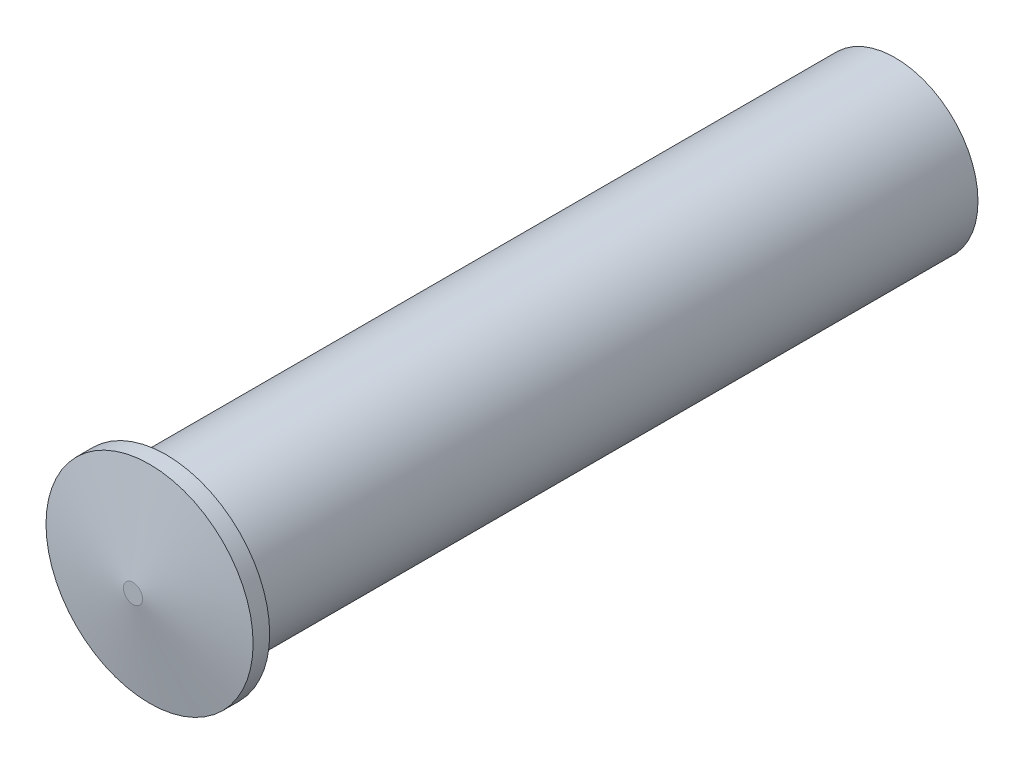
ISO-10303-21;
HEADER;
FILE_DESCRIPTION(('STEP AP214'),'2;1');
FILE_NAME('part.step','',(''),(''),'','','');
FILE_SCHEMA(('AUTOMOTIVE_DESIGN { 1 0 10303 214 1 1 1 1 }'));
ENDSEC;
DATA;
#1=APPLICATION_CONTEXT('core data for automotive mechanical design processes');
#2=APPLICATION_PROTOCOL_DEFINITION('international standard','automotive_design',2000,#1);
#3=PRODUCT_CONTEXT('',#1,'mechanical');
#4=PRODUCT('Part','Part','',(#3));
#5=PRODUCT_RELATED_PRODUCT_CATEGORY('part','',(#4));
#6=PRODUCT_DEFINITION_FORMATION('','',#4);
#7=PRODUCT_DEFINITION_CONTEXT('part definition',#1,'design');
#8=PRODUCT_DEFINITION('design','',#6,#7);
#9=PRODUCT_DEFINITION_SHAPE('','',#8);
#10=(LENGTH_UNIT() NAMED_UNIT(*) SI_UNIT(.MILLI.,.METRE.));
#11=(NAMED_UNIT(*) PLANE_ANGLE_UNIT() SI_UNIT($,.RADIAN.));
#12=(NAMED_UNIT(*) SI_UNIT($,.STERADIAN.) SOLID_ANGLE_UNIT());
#13=UNCERTAINTY_MEASURE_WITH_UNIT(LENGTH_MEASURE(1.E-05),#10,'distance_accuracy_value','');
#14=(GEOMETRIC_REPRESENTATION_CONTEXT(3) GLOBAL_UNCERTAINTY_ASSIGNED_CONTEXT((#13)) GLOBAL_UNIT_ASSIGNED_CONTEXT((#10,
#11,#12)) REPRESENTATION_CONTEXT('',''));
#15=CARTESIAN_POINT('',(0.,0.,0.));
#16=DIRECTION('',(0.,0.,1.));
#17=DIRECTION('',(1.,0.,0.));
#18=AXIS2_PLACEMENT_3D('',#15,#16,#17);
#19=CARTESIAN_POINT('',(0.,0.,-88.));
#20=DIRECTION('',(0.,0.,1.));
#21=DIRECTION('',(1.,0.,0.));
#22=AXIS2_PLACEMENT_3D('',#19,#20,#21);
#23=CYLINDRICAL_SURFACE('',#22,10.);
#24=CARTESIAN_POINT('',(0.,0.,-88.));
#25=DIRECTION('',(0.,0.,1.));
#26=DIRECTION('',(1.,0.,0.));
#27=AXIS2_PLACEMENT_3D('',#24,#25,#26);
#28=CIRCLE('',#27,10.);
#29=CARTESIAN_POINT('',(10.,0.,-88.));
#30=VERTEX_POINT('',#29);
#31=EDGE_CURVE('E10',#30,#30,#28,.T.);
#32=ORIENTED_EDGE('',*,*,#31,.T.);
#33=EDGE_LOOP('',(#32));
#34=FACE_BOUND('',#33,.T.);
#35=CARTESIAN_POINT('',(0.,0.,0.));
#36=DIRECTION('',(0.,0.,1.));
#37=DIRECTION('',(1.,0.,0.));
#38=AXIS2_PLACEMENT_3D('',#35,#36,#37);
#39=CIRCLE('',#38,10.);
#40=CARTESIAN_POINT('',(10.,0.,0.));
#41=VERTEX_POINT('',#40);
#42=EDGE_CURVE('E37',#41,#41,#39,.T.);
#43=ORIENTED_EDGE('',*,*,#42,.F.);
#44=EDGE_LOOP('',(#43));
#45=FACE_BOUND('',#44,.T.);
#46=ADVANCED_FACE('F34',(#34,#45),#23,.T.);
#47=CARTESIAN_POINT('',(0.,0.,-88.));
#48=DIRECTION('',(0.,0.,1.));
#49=DIRECTION('',(1.,0.,0.));
#50=AXIS2_PLACEMENT_3D('',#47,#48,#49);
#51=PLANE('',#50);
#52=CARTESIAN_POINT('',(0.,0.,-88.));
#53=DIRECTION('',(0.,0.,-1.));
#54=DIRECTION('',(-1.,0.,0.));
#55=AXIS2_PLACEMENT_3D('',#52,#53,#54);
#56=CIRCLE('',#55,8.);
#57=CARTESIAN_POINT('',(-8.,0.,-88.));
#58=VERTEX_POINT('',#57);
#59=EDGE_CURVE('E55',#58,#58,#56,.T.);
#60=ORIENTED_EDGE('',*,*,#59,.F.);
#61=EDGE_LOOP('',(#60));
#62=FACE_BOUND('',#61,.T.);
#63=ORIENTED_EDGE('',*,*,#31,.F.);
#64=EDGE_LOOP('',(#63));
#65=FACE_BOUND('',#64,.T.);
#66=ADVANCED_FACE('F70',(#62,#65),#51,.F.);
#67=CARTESIAN_POINT('',(0.,0.,2.));
#68=DIRECTION('',(0.,0.,-1.));
#69=DIRECTION('',(-1.,0.,0.));
#70=AXIS2_PLACEMENT_3D('',#67,#68,#69);
#71=CYLINDRICAL_SURFACE('',#70,12.5);
#72=CARTESIAN_POINT('',(0.,0.,2.));
#73=DIRECTION('',(0.,0.,1.));
#74=DIRECTION('',(1.,0.,0.));
#75=AXIS2_PLACEMENT_3D('',#72,#73,#74);
#76=CIRCLE('',#75,12.5);
#77=CARTESIAN_POINT('',(12.5,0.,2.));
#78=VERTEX_POINT('',#77);
#79=EDGE_CURVE('E44',#78,#78,#76,.T.);
#80=ORIENTED_EDGE('',*,*,#79,.F.);
#81=EDGE_LOOP('',(#80));
#82=FACE_BOUND('',#81,.T.);
#83=CARTESIAN_POINT('',(0.,0.,0.));
#84=DIRECTION('',(0.,0.,1.));
#85=DIRECTION('',(1.,0.,0.));
#86=AXIS2_PLACEMENT_3D('',#83,#84,#85);
#87=CIRCLE('',#86,12.5);
#88=CARTESIAN_POINT('',(12.5,0.,0.));
#89=VERTEX_POINT('',#88);
#90=EDGE_CURVE('E46',#89,#89,#87,.T.);
#91=ORIENTED_EDGE('',*,*,#90,.T.);
#92=EDGE_LOOP('',(#91));
#93=FACE_BOUND('',#92,.T.);
#94=ADVANCED_FACE('F73',(#82,#93),#71,.T.);
#95=CARTESIAN_POINT('',(0.,0.,0.));
#96=DIRECTION('',(0.,0.,1.));
#97=DIRECTION('',(1.,0.,0.));
#98=AXIS2_PLACEMENT_3D('',#95,#96,#97);
#99=PLANE('',#98);
#100=ORIENTED_EDGE('',*,*,#42,.T.);
#101=EDGE_LOOP('',(#100));
#102=FACE_BOUND('',#101,.T.);
#103=ORIENTED_EDGE('',*,*,#90,.F.);
#104=EDGE_LOOP('',(#103));
#105=FACE_BOUND('',#104,.T.);
#106=ADVANCED_FACE('F78',(#102,#105),#99,.F.);
#107=CARTESIAN_POINT('',(0.,0.,2.));
#108=DIRECTION('',(0.,0.,-1.));
#109=DIRECTION('',(1.,0.,0.));
#110=AXIS2_PLACEMENT_3D('',#107,#108,#109);
#111=CONICAL_SURFACE('',#110,12.5,1.39626340159547);
#112=CARTESIAN_POINT('',(0.,0.,4.));
#113=DIRECTION('',(0.,0.,1.));
#114=DIRECTION('',(1.,0.,0.));
#115=AXIS2_PLACEMENT_3D('',#112,#113,#114);
#116=CIRCLE('',#115,1.15743636076438);
#117=CARTESIAN_POINT('',(1.15743636076439,0.,4.));
#118=VERTEX_POINT('',#117);
#119=EDGE_CURVE('E49',#118,#118,#116,.T.);
#120=CARTESIAN_POINT('',(1.15743636076439,0.,4.));
#121=CARTESIAN_POINT('',(1.27558806533976,0.,3.97916666666667));
#122=CARTESIAN_POINT('',(1.39373976991513,0.,3.95833333333333));
#123=CARTESIAN_POINT('',(1.63004317906587,0.,3.91666666666667));
#124=CARTESIAN_POINT('',(1.74819488364124,0.,3.89583333333333));
#125=CARTESIAN_POINT('',(1.98449829279198,0.,3.85416666666667));
#126=CARTESIAN_POINT('',(2.10264999736735,0.,3.83333333333333));
#127=CARTESIAN_POINT('',(2.3389534065181,0.,3.79166666666667));
#128=CARTESIAN_POINT('',(2.45710511109347,0.,3.77083333333333));
#129=CARTESIAN_POINT('',(2.69340852024421,0.,3.72916666666667));
#130=CARTESIAN_POINT('',(2.81156022481958,0.,3.70833333333333));
#131=CARTESIAN_POINT('',(3.04786363397032,0.,3.66666666666667));
#132=CARTESIAN_POINT('',(3.16601533854569,0.,3.64583333333333));
#133=CARTESIAN_POINT('',(3.40231874769643,0.,3.60416666666667));
#134=CARTESIAN_POINT('',(3.52047045227181,0.,3.58333333333333));
#135=CARTESIAN_POINT('',(3.75677386142255,0.,3.54166666666667));
#136=CARTESIAN_POINT('',(3.87492556599792,0.,3.52083333333333));
#137=CARTESIAN_POINT('',(4.11122897514866,0.,3.47916666666667));
#138=CARTESIAN_POINT('',(4.22938067972403,0.,3.45833333333333));
#139=CARTESIAN_POINT('',(4.46568408887477,0.,3.41666666666667));
#140=CARTESIAN_POINT('',(4.58383579345014,0.,3.39583333333333));
#141=CARTESIAN_POINT('',(4.82013920260089,0.,3.35416666666667));
#142=CARTESIAN_POINT('',(4.93829090717626,0.,3.33333333333333));
#143=CARTESIAN_POINT('',(5.174594316327,0.,3.29166666666667));
#144=CARTESIAN_POINT('',(5.29274602090237,0.,3.27083333333333));
#145=CARTESIAN_POINT('',(5.52904943005311,0.,3.22916666666667));
#146=CARTESIAN_POINT('',(5.64720113462848,0.,3.20833333333333));
#147=CARTESIAN_POINT('',(5.88350454377923,0.,3.16666666666667));
#148=CARTESIAN_POINT('',(6.0016562483546,0.,3.14583333333333));
#149=CARTESIAN_POINT('',(6.23795965750534,0.,3.10416666666667));
#150=CARTESIAN_POINT('',(6.35611136208071,0.,3.08333333333333));
#151=CARTESIAN_POINT('',(6.59241477123145,0.,3.04166666666667));
#152=CARTESIAN_POINT('',(6.71056647580682,0.,3.02083333333333));
#153=CARTESIAN_POINT('',(6.94686988495756,0.,2.97916666666667));
#154=CARTESIAN_POINT('',(7.06502158953294,0.,2.95833333333333));
#155=CARTESIAN_POINT('',(7.30132499868368,0.,2.91666666666667));
#156=CARTESIAN_POINT('',(7.41947670325905,0.,2.89583333333333));
#157=CARTESIAN_POINT('',(7.65578011240979,0.,2.85416666666667));
#158=CARTESIAN_POINT('',(7.77393181698516,0.,2.83333333333333));
#159=CARTESIAN_POINT('',(8.0102352261359,0.,2.79166666666667));
#160=CARTESIAN_POINT('',(8.12838693071127,0.,2.77083333333333));
#161=CARTESIAN_POINT('',(8.36469033986202,0.,2.72916666666667));
#162=CARTESIAN_POINT('',(8.48284204443739,0.,2.70833333333333));
#163=CARTESIAN_POINT('',(8.71914545358813,0.,2.66666666666667));
#164=CARTESIAN_POINT('',(8.8372971581635,0.,2.64583333333333));
#165=CARTESIAN_POINT('',(9.07360056731424,0.,2.60416666666667));
#166=CARTESIAN_POINT('',(9.19175227188961,0.,2.58333333333333));
#167=CARTESIAN_POINT('',(9.42805568104035,0.,2.54166666666667));
#168=CARTESIAN_POINT('',(9.54620738561573,0.,2.52083333333333));
#169=CARTESIAN_POINT('',(9.78251079476647,0.,2.47916666666667));
#170=CARTESIAN_POINT('',(9.90066249934184,0.,2.45833333333333));
#171=CARTESIAN_POINT('',(10.1369659084926,0.,2.41666666666667));
#172=CARTESIAN_POINT('',(10.255117613068,0.,2.39583333333333));
#173=CARTESIAN_POINT('',(10.4914210222187,0.,2.35416666666667));
#174=CARTESIAN_POINT('',(10.6095727267941,0.,2.33333333333333));
#175=CARTESIAN_POINT('',(10.8458761359448,0.,2.29166666666667));
#176=CARTESIAN_POINT('',(10.9640278405202,0.,2.27083333333333));
#177=CARTESIAN_POINT('',(11.2003312496709,0.,2.22916666666667));
#178=CARTESIAN_POINT('',(11.3184829542463,0.,2.20833333333333));
#179=CARTESIAN_POINT('',(11.554786363397,0.,2.16666666666667));
#180=CARTESIAN_POINT('',(11.6729380679724,0.,2.14583333333333));
#181=CARTESIAN_POINT('',(11.9092414771231,0.,2.10416666666667));
#182=CARTESIAN_POINT('',(12.0273931816985,0.,2.08333333333333));
#183=CARTESIAN_POINT('',(12.2636965908493,0.,2.04166666666667));
#184=CARTESIAN_POINT('',(12.3818482954246,0.,2.02083333333333));
#185=CARTESIAN_POINT('',(12.5,0.,2.));
#186=B_SPLINE_CURVE_WITH_KNOTS('',3,(#120,#121,#122,#123,#124,#125,#126,#127,#128,#129,#130,
#131,#132,#133,#134,#135,#136,#137,#138,#139,#140,#141,#142,#143,#144,#145,#146,#147,#148,#149,
#150,#151,#152,#153,#154,#155,#156,#157,#158,#159,#160,#161,#162,#163,#164,#165,#166,#167,#168,
#169,#170,#171,#172,#173,#174,#175,#176,#177,#178,#179,#180,#181,#182,#183,#184,#185),
.UNSPECIFIED.,.F.,.F.,(4,2,2,2,2,2,2,2,2,2,2,2,2,2,2,2,2,2,2,2,2,2,2,2,2,2,2,2,2,2,2,2,4),(0.,
0.359923155196484,0.719846310392966,1.07976946558945,1.43969262078593,1.79961577598242,
2.1595389311789,2.51946208637538,2.87938524157187,3.23930839676835,3.59923155196483,
3.95915470716131,4.3190778623578,4.67900101755428,5.03892417275076,5.39884732794725,
5.75877048314373,6.11869363834021,6.4786167935367,6.83853994873318,7.19846310392966,
7.55838625912615,7.91830941432263,8.27823256951911,8.6381557247156,8.99807887991208,
9.35800203510856,9.71792519030505,10.0778483455015,10.437771500698,10.7976946558945,
11.157617811091,11.5175409662875),.UNSPECIFIED.);
#187=EDGE_CURVE('BSEAM84',#118,#78,#186,.T.);
#188=ORIENTED_EDGE('',*,*,#119,.F.);
#189=ORIENTED_EDGE('',*,*,#79,.T.);
#190=ORIENTED_EDGE('',*,*,#187,.T.);
#191=ORIENTED_EDGE('',*,*,#187,.F.);
#192=EDGE_LOOP('',(#188,#190,#189,#191));
#193=FACE_BOUND('',#192,.T.);
#194=ADVANCED_FACE('F84',(#193),#111,.T.);
#195=CARTESIAN_POINT('',(0.,0.,4.));
#196=DIRECTION('',(0.,0.,1.));
#197=DIRECTION('',(1.,0.,0.));
#198=AXIS2_PLACEMENT_3D('',#195,#196,#197);
#199=PLANE('',#198);
#200=ORIENTED_EDGE('',*,*,#119,.T.);
#201=EDGE_LOOP('',(#200));
#202=FACE_BOUND('',#201,.T.);
#203=ADVANCED_FACE('F66',(#202),#199,.T.);
#204=CARTESIAN_POINT('',(0.,0.,0.));
#205=DIRECTION('',(0.,0.,-1.));
#206=DIRECTION('',(-1.,0.,0.));
#207=AXIS2_PLACEMENT_3D('',#204,#205,#206);
#208=CYLINDRICAL_SURFACE('',#207,8.);
#209=CARTESIAN_POINT('',(0.,0.,0.));
#210=DIRECTION('',(0.,0.,-1.));
#211=DIRECTION('',(-1.,0.,0.));
#212=AXIS2_PLACEMENT_3D('',#209,#210,#211);
#213=CIRCLE('',#212,8.);
#214=CARTESIAN_POINT('',(-8.,0.,0.));
#215=VERTEX_POINT('',#214);
#216=EDGE_CURVE('E54',#215,#215,#213,.T.);
#217=ORIENTED_EDGE('',*,*,#216,.F.);
#218=EDGE_LOOP('',(#217));
#219=FACE_BOUND('',#218,.T.);
#220=ORIENTED_EDGE('',*,*,#59,.T.);
#221=EDGE_LOOP('',(#220));
#222=FACE_BOUND('',#221,.T.);
#223=ADVANCED_FACE('F63',(#219,#222),#208,.F.);
#224=CARTESIAN_POINT('',(0.,0.,0.));
#225=DIRECTION('',(0.,0.,-1.));
#226=DIRECTION('',(-1.,0.,0.));
#227=AXIS2_PLACEMENT_3D('',#224,#225,#226);
#228=PLANE('',#227);
#229=ORIENTED_EDGE('',*,*,#216,.T.);
#230=EDGE_LOOP('',(#229));
#231=FACE_BOUND('',#230,.T.);
#232=ADVANCED_FACE('F61',(#231),#228,.T.);
#233=CLOSED_SHELL('',(#46,#66,#94,#106,#194,#203,#223,#232));
#234=MANIFOLD_SOLID_BREP('B2',#233);
#235=ADVANCED_BREP_SHAPE_REPRESENTATION('',(#18,#234),#14);
#236=SHAPE_DEFINITION_REPRESENTATION(#9,#235);
ENDSEC;
END-ISO-10303-21;
